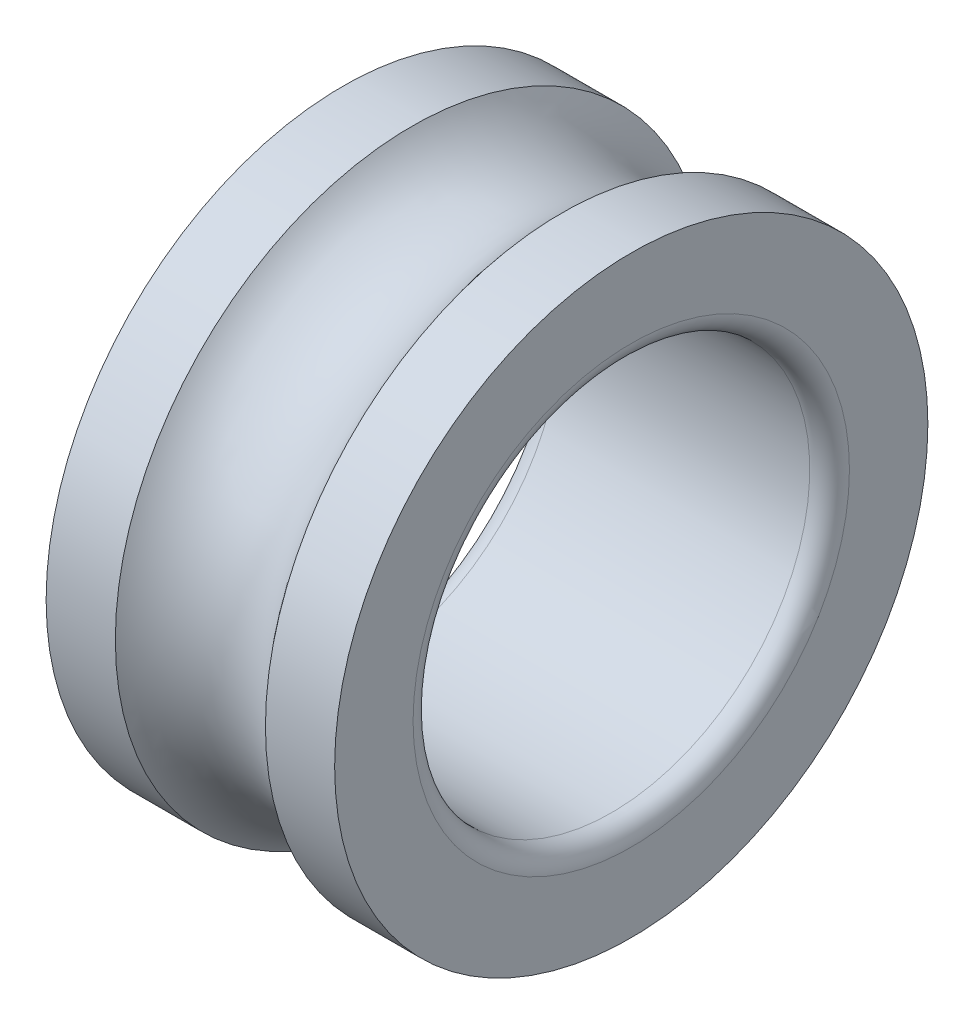
ISO-10303-21;
HEADER;
FILE_DESCRIPTION(('STEP AP214'),'2;1');
FILE_NAME('part.step','',(''),(''),'','','');
FILE_SCHEMA(('AUTOMOTIVE_DESIGN { 1 0 10303 214 1 1 1 1 }'));
ENDSEC;
DATA;
#1=APPLICATION_CONTEXT('core data for automotive mechanical design processes');
#2=APPLICATION_PROTOCOL_DEFINITION('international standard','automotive_design',2000,#1);
#3=PRODUCT_CONTEXT('',#1,'mechanical');
#4=PRODUCT('Part','Part','',(#3));
#5=PRODUCT_RELATED_PRODUCT_CATEGORY('part','',(#4));
#6=PRODUCT_DEFINITION_FORMATION('','',#4);
#7=PRODUCT_DEFINITION_CONTEXT('part definition',#1,'design');
#8=PRODUCT_DEFINITION('design','',#6,#7);
#9=PRODUCT_DEFINITION_SHAPE('','',#8);
#10=(LENGTH_UNIT() NAMED_UNIT(*) SI_UNIT(.MILLI.,.METRE.));
#11=(NAMED_UNIT(*) PLANE_ANGLE_UNIT() SI_UNIT($,.RADIAN.));
#12=(NAMED_UNIT(*) SI_UNIT($,.STERADIAN.) SOLID_ANGLE_UNIT());
#13=UNCERTAINTY_MEASURE_WITH_UNIT(LENGTH_MEASURE(1.E-05),#10,'distance_accuracy_value','');
#14=(GEOMETRIC_REPRESENTATION_CONTEXT(3) GLOBAL_UNCERTAINTY_ASSIGNED_CONTEXT((#13)) GLOBAL_UNIT_ASSIGNED_CONTEXT((#10,
#11,#12)) REPRESENTATION_CONTEXT('',''));
#15=CARTESIAN_POINT('',(0.,0.,0.));
#16=DIRECTION('',(0.,0.,1.));
#17=DIRECTION('',(1.,0.,0.));
#18=AXIS2_PLACEMENT_3D('',#15,#16,#17);
#19=CARTESIAN_POINT('',(1.10000000000035,0.,0.));
#20=DIRECTION('',(-1.,0.,0.));
#21=DIRECTION('',(0.,0.,1.));
#22=AXIS2_PLACEMENT_3D('',#19,#20,#21);
#23=TOROIDAL_SURFACE('',#22,12.1000000000003,1.10000000000035);
#24=CARTESIAN_POINT('',(1.1,0.,0.));
#25=DIRECTION('',(-1.,0.,0.));
#26=DIRECTION('',(0.,0.,1.));
#27=AXIS2_PLACEMENT_3D('',#24,#25,#26);
#28=CIRCLE('',#27,11.);
#29=CARTESIAN_POINT('',(1.1,0.,11.));
#30=VERTEX_POINT('',#29);
#31=EDGE_CURVE('E10',#30,#30,#28,.T.);
#32=ORIENTED_EDGE('',*,*,#31,.F.);
#33=EDGE_LOOP('',(#32));
#34=FACE_BOUND('',#33,.T.);
#35=CARTESIAN_POINT('',(0.,0.,0.));
#36=DIRECTION('',(-1.,0.,0.));
#37=DIRECTION('',(0.,0.,1.));
#38=AXIS2_PLACEMENT_3D('',#35,#36,#37);
#39=CIRCLE('',#38,12.1);
#40=CARTESIAN_POINT('',(0.,0.,12.1));
#41=VERTEX_POINT('',#40);
#42=EDGE_CURVE('E63',#41,#41,#39,.T.);
#43=ORIENTED_EDGE('',*,*,#42,.T.);
#44=EDGE_LOOP('',(#43));
#45=FACE_BOUND('',#44,.T.);
#46=ADVANCED_FACE('F35',(#34,#45),#23,.T.);
#47=CARTESIAN_POINT('',(50.,0.,0.));
#48=DIRECTION('',(-1.,0.,0.));
#49=DIRECTION('',(0.,0.,1.));
#50=AXIS2_PLACEMENT_3D('',#47,#48,#49);
#51=CYLINDRICAL_SURFACE('',#50,11.);
#52=CARTESIAN_POINT('',(14.9,0.,0.));
#53=DIRECTION('',(-1.,0.,0.));
#54=DIRECTION('',(0.,0.,1.));
#55=AXIS2_PLACEMENT_3D('',#52,#53,#54);
#56=CIRCLE('',#55,11.);
#57=CARTESIAN_POINT('',(14.9,0.,11.));
#58=VERTEX_POINT('',#57);
#59=EDGE_CURVE('E41',#58,#58,#56,.T.);
#60=ORIENTED_EDGE('',*,*,#59,.F.);
#61=EDGE_LOOP('',(#60));
#62=FACE_BOUND('',#61,.T.);
#63=ORIENTED_EDGE('',*,*,#31,.T.);
#64=EDGE_LOOP('',(#63));
#65=FACE_BOUND('',#64,.T.);
#66=ADVANCED_FACE('F100',(#62,#65),#51,.F.);
#67=CARTESIAN_POINT('',(14.8999999999993,0.,0.));
#68=DIRECTION('',(-1.,0.,0.));
#69=DIRECTION('',(0.,0.,1.));
#70=AXIS2_PLACEMENT_3D('',#67,#68,#69);
#71=TOROIDAL_SURFACE('',#70,12.1000000000007,1.10000000000069);
#72=CARTESIAN_POINT('',(16.,0.,0.));
#73=DIRECTION('',(-1.,0.,0.));
#74=DIRECTION('',(0.,0.,1.));
#75=AXIS2_PLACEMENT_3D('',#72,#73,#74);
#76=CIRCLE('',#75,12.0999999999993);
#77=CARTESIAN_POINT('',(16.,0.,12.0999999999993));
#78=VERTEX_POINT('',#77);
#79=EDGE_CURVE('E45',#78,#78,#76,.T.);
#80=ORIENTED_EDGE('',*,*,#79,.F.);
#81=EDGE_LOOP('',(#80));
#82=FACE_BOUND('',#81,.T.);
#83=ORIENTED_EDGE('',*,*,#59,.T.);
#84=EDGE_LOOP('',(#83));
#85=FACE_BOUND('',#84,.T.);
#86=ADVANCED_FACE('F95',(#82,#85),#71,.T.);
#87=CARTESIAN_POINT('',(16.,12.0999999999993,0.));
#88=DIRECTION('',(-1.,0.,0.));
#89=DIRECTION('',(0.,0.,1.));
#90=AXIS2_PLACEMENT_3D('',#87,#88,#89);
#91=PLANE('',#90);
#92=CARTESIAN_POINT('',(16.,0.,0.));
#93=DIRECTION('',(-1.,0.,0.));
#94=DIRECTION('',(0.,0.,1.));
#95=AXIS2_PLACEMENT_3D('',#92,#93,#94);
#96=CIRCLE('',#95,16.45);
#97=CARTESIAN_POINT('',(16.,0.,16.45));
#98=VERTEX_POINT('',#97);
#99=EDGE_CURVE('E49',#98,#98,#96,.T.);
#100=ORIENTED_EDGE('',*,*,#99,.F.);
#101=EDGE_LOOP('',(#100));
#102=FACE_BOUND('',#101,.T.);
#103=ORIENTED_EDGE('',*,*,#79,.T.);
#104=EDGE_LOOP('',(#103));
#105=FACE_BOUND('',#104,.T.);
#106=ADVANCED_FACE('F89',(#102,#105),#91,.F.);
#107=CARTESIAN_POINT('',(50.,0.,0.));
#108=DIRECTION('',(-1.,0.,0.));
#109=DIRECTION('',(0.,0.,1.));
#110=AXIS2_PLACEMENT_3D('',#107,#108,#109);
#111=CYLINDRICAL_SURFACE('',#110,16.45);
#112=CARTESIAN_POINT('',(12.161482938809,0.,0.));
#113=DIRECTION('',(-1.,0.,0.));
#114=DIRECTION('',(0.,0.,1.));
#115=AXIS2_PLACEMENT_3D('',#112,#113,#114);
#116=CIRCLE('',#115,16.45);
#117=CARTESIAN_POINT('',(12.161482938809,0.,16.45));
#118=VERTEX_POINT('',#117);
#119=EDGE_CURVE('E54',#118,#118,#116,.T.);
#120=ORIENTED_EDGE('',*,*,#119,.F.);
#121=EDGE_LOOP('',(#120));
#122=FACE_BOUND('',#121,.T.);
#123=ORIENTED_EDGE('',*,*,#99,.T.);
#124=EDGE_LOOP('',(#123));
#125=FACE_BOUND('',#124,.T.);
#126=ADVANCED_FACE('F83',(#122,#125),#111,.T.);
#127=CARTESIAN_POINT('',(7.9999999999999,0.,0.));
#128=DIRECTION('',(-1.,0.,0.));
#129=DIRECTION('',(0.,0.,1.));
#130=AXIS2_PLACEMENT_3D('',#127,#128,#129);
#131=TOROIDAL_SURFACE('',#130,19.4999999999998,5.15949999999982);
#132=CARTESIAN_POINT('',(3.8385170611908,0.,0.));
#133=DIRECTION('',(-1.,0.,0.));
#134=DIRECTION('',(0.,0.,1.));
#135=AXIS2_PLACEMENT_3D('',#132,#133,#134);
#136=CIRCLE('',#135,16.45);
#137=CARTESIAN_POINT('',(3.8385170611908,0.,16.45));
#138=VERTEX_POINT('',#137);
#139=EDGE_CURVE('E57',#138,#138,#136,.T.);
#140=ORIENTED_EDGE('',*,*,#139,.F.);
#141=EDGE_LOOP('',(#140));
#142=FACE_BOUND('',#141,.T.);
#143=ORIENTED_EDGE('',*,*,#119,.T.);
#144=EDGE_LOOP('',(#143));
#145=FACE_BOUND('',#144,.T.);
#146=ADVANCED_FACE('F77',(#142,#145),#131,.F.);
#147=CARTESIAN_POINT('',(50.,0.,0.));
#148=DIRECTION('',(-1.,0.,0.));
#149=DIRECTION('',(0.,0.,1.));
#150=AXIS2_PLACEMENT_3D('',#147,#148,#149);
#151=CYLINDRICAL_SURFACE('',#150,16.45);
#152=CARTESIAN_POINT('',(0.,0.,0.));
#153=DIRECTION('',(-1.,0.,0.));
#154=DIRECTION('',(0.,0.,1.));
#155=AXIS2_PLACEMENT_3D('',#152,#153,#154);
#156=CIRCLE('',#155,16.45);
#157=CARTESIAN_POINT('',(0.,0.,16.45));
#158=VERTEX_POINT('',#157);
#159=EDGE_CURVE('E60',#158,#158,#156,.T.);
#160=ORIENTED_EDGE('',*,*,#159,.F.);
#161=EDGE_LOOP('',(#160));
#162=FACE_BOUND('',#161,.T.);
#163=ORIENTED_EDGE('',*,*,#139,.T.);
#164=EDGE_LOOP('',(#163));
#165=FACE_BOUND('',#164,.T.);
#166=ADVANCED_FACE('F71',(#162,#165),#151,.T.);
#167=CARTESIAN_POINT('',(0.,16.45,0.));
#168=DIRECTION('',(1.,0.,0.));
#169=DIRECTION('',(0.,0.,-1.));
#170=AXIS2_PLACEMENT_3D('',#167,#168,#169);
#171=PLANE('',#170);
#172=ORIENTED_EDGE('',*,*,#42,.F.);
#173=EDGE_LOOP('',(#172));
#174=FACE_BOUND('',#173,.T.);
#175=ORIENTED_EDGE('',*,*,#159,.T.);
#176=EDGE_LOOP('',(#175));
#177=FACE_BOUND('',#176,.T.);
#178=ADVANCED_FACE('F68',(#174,#177),#171,.F.);
#179=CLOSED_SHELL('',(#46,#66,#86,#106,#126,#146,#166,#178));
#180=MANIFOLD_SOLID_BREP('B2',#179);
#181=ADVANCED_BREP_SHAPE_REPRESENTATION('',(#18,#180),#14);
#182=SHAPE_DEFINITION_REPRESENTATION(#9,#181);
ENDSEC;
END-ISO-10303-21;
